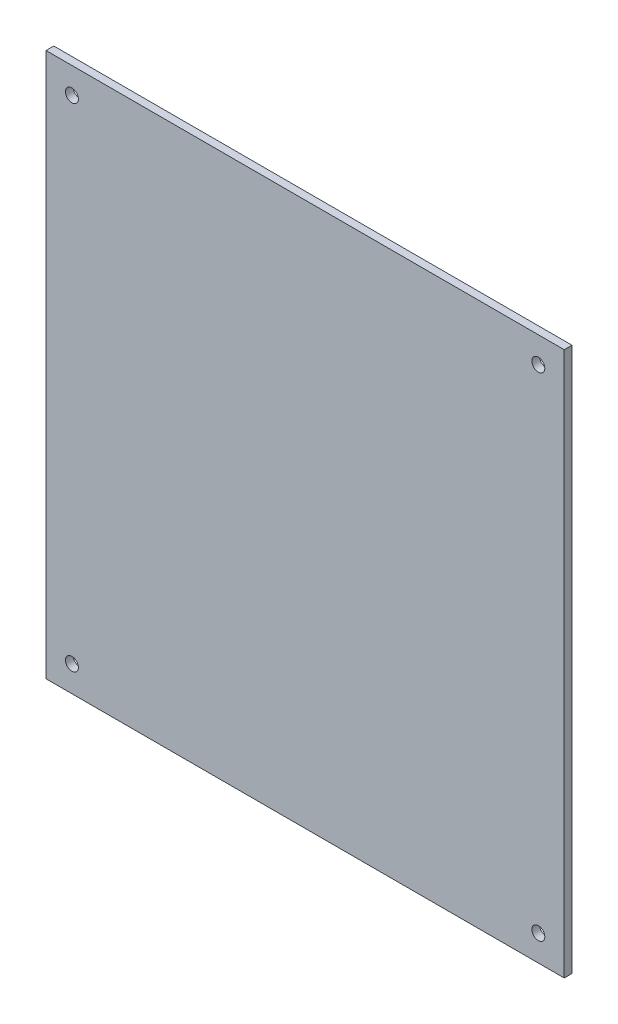
ISO-10303-21;
HEADER;
FILE_DESCRIPTION(('STEP AP214'),'2;1');
FILE_NAME('part.step','',(''),(''),'','','');
FILE_SCHEMA(('AUTOMOTIVE_DESIGN { 1 0 10303 214 1 1 1 1 }'));
ENDSEC;
DATA;
#1=APPLICATION_CONTEXT('core data for automotive mechanical design processes');
#2=APPLICATION_PROTOCOL_DEFINITION('international standard','automotive_design',2000,#1);
#3=PRODUCT_CONTEXT('',#1,'mechanical');
#4=PRODUCT('Part','Part','',(#3));
#5=PRODUCT_RELATED_PRODUCT_CATEGORY('part','',(#4));
#6=PRODUCT_DEFINITION_FORMATION('','',#4);
#7=PRODUCT_DEFINITION_CONTEXT('part definition',#1,'design');
#8=PRODUCT_DEFINITION('design','',#6,#7);
#9=PRODUCT_DEFINITION_SHAPE('','',#8);
#10=(LENGTH_UNIT() NAMED_UNIT(*) SI_UNIT(.MILLI.,.METRE.));
#11=(NAMED_UNIT(*) PLANE_ANGLE_UNIT() SI_UNIT($,.RADIAN.));
#12=(NAMED_UNIT(*) SI_UNIT($,.STERADIAN.) SOLID_ANGLE_UNIT());
#13=UNCERTAINTY_MEASURE_WITH_UNIT(LENGTH_MEASURE(1.E-05),#10,'distance_accuracy_value','');
#14=(GEOMETRIC_REPRESENTATION_CONTEXT(3) GLOBAL_UNCERTAINTY_ASSIGNED_CONTEXT((#13)) GLOBAL_UNIT_ASSIGNED_CONTEXT((#10,
#11,#12)) REPRESENTATION_CONTEXT('',''));
#15=CARTESIAN_POINT('',(0.,0.,0.));
#16=DIRECTION('',(0.,0.,1.));
#17=DIRECTION('',(1.,0.,0.));
#18=AXIS2_PLACEMENT_3D('',#15,#16,#17);
#19=CARTESIAN_POINT('',(2.19538609389673E-13,0.,-113.));
#20=DIRECTION('',(0.,0.,-1.));
#21=DIRECTION('',(-1.,0.,0.));
#22=AXIS2_PLACEMENT_3D('',#19,#20,#21);
#23=PLANE('',#22);
#24=CARTESIAN_POINT('',(2.18020859158961E-13,20.0000000000001,-113.));
#25=DIRECTION('',(0.,0.,-1.));
#26=DIRECTION('',(1.,0.,0.));
#27=AXIS2_PLACEMENT_3D('',#24,#25,#26);
#28=CIRCLE('',#27,2.5);
#29=CARTESIAN_POINT('',(2.50000000000022,20.0000000000001,-113.));
#30=VERTEX_POINT('',#29);
#31=EDGE_CURVE('E124',#30,#30,#28,.T.);
#32=ORIENTED_EDGE('',*,*,#31,.F.);
#33=EDGE_LOOP('',(#32));
#34=FACE_BOUND('',#33,.T.);
#35=CARTESIAN_POINT('',(2.18020859158961E-13,210.,-113.));
#36=DIRECTION('',(0.,0.,-1.));
#37=DIRECTION('',(-1.,0.,0.));
#38=AXIS2_PLACEMENT_3D('',#35,#36,#37);
#39=CIRCLE('',#38,2.5);
#40=CARTESIAN_POINT('',(-2.49999999999978,210.,-113.));
#41=VERTEX_POINT('',#40);
#42=EDGE_CURVE('E103',#41,#41,#39,.T.);
#43=ORIENTED_EDGE('',*,*,#42,.F.);
#44=EDGE_LOOP('',(#43));
#45=FACE_BOUND('',#44,.T.);
#46=DIRECTION('',(0.,-1.,0.));
#47=VECTOR('',#46,1.);
#48=CARTESIAN_POINT('',(190.,220.,-113.));
#49=LINE('',#48,#47);
#50=CARTESIAN_POINT('',(190.,220.,-113.));
#51=VERTEX_POINT('',#50);
#52=CARTESIAN_POINT('',(190.,10.0000000000001,-113.));
#53=VERTEX_POINT('',#52);
#54=EDGE_CURVE('E88',#51,#53,#49,.T.);
#55=ORIENTED_EDGE('',*,*,#54,.T.);
#56=DIRECTION('',(-1.,0.,0.));
#57=VECTOR('',#56,1.);
#58=CARTESIAN_POINT('',(190.,10.0000000000001,-113.));
#59=LINE('',#58,#57);
#60=CARTESIAN_POINT('',(-10.,10.0000000000001,-113.));
#61=VERTEX_POINT('',#60);
#62=EDGE_CURVE('E83',#53,#61,#59,.T.);
#63=ORIENTED_EDGE('',*,*,#62,.T.);
#64=DIRECTION('',(0.,1.,0.));
#65=VECTOR('',#64,1.);
#66=CARTESIAN_POINT('',(-10.,220.,-113.));
#67=LINE('',#66,#65);
#68=CARTESIAN_POINT('',(-10.,220.,-113.));
#69=VERTEX_POINT('',#68);
#70=EDGE_CURVE('E86',#61,#69,#67,.T.);
#71=ORIENTED_EDGE('',*,*,#70,.T.);
#72=DIRECTION('',(1.,0.,0.));
#73=VECTOR('',#72,1.);
#74=CARTESIAN_POINT('',(190.,220.,-113.));
#75=LINE('',#74,#73);
#76=EDGE_CURVE('E53',#69,#51,#75,.T.);
#77=ORIENTED_EDGE('',*,*,#76,.T.);
#78=EDGE_LOOP('',(#55,#63,#71,#77));
#79=FACE_BOUND('',#78,.T.);
#80=CARTESIAN_POINT('',(180.,210.,-113.));
#81=DIRECTION('',(0.,0.,-1.));
#82=DIRECTION('',(1.,0.,0.));
#83=AXIS2_PLACEMENT_3D('',#80,#81,#82);
#84=CIRCLE('',#83,2.5);
#85=CARTESIAN_POINT('',(182.5,210.,-113.));
#86=VERTEX_POINT('',#85);
#87=EDGE_CURVE('E118',#86,#86,#84,.T.);
#88=ORIENTED_EDGE('',*,*,#87,.F.);
#89=EDGE_LOOP('',(#88));
#90=FACE_BOUND('',#89,.T.);
#91=CARTESIAN_POINT('',(180.,20.0000000000001,-113.));
#92=DIRECTION('',(0.,0.,-1.));
#93=DIRECTION('',(-1.,0.,0.));
#94=AXIS2_PLACEMENT_3D('',#91,#92,#93);
#95=CIRCLE('',#94,2.5);
#96=CARTESIAN_POINT('',(177.5,20.0000000000001,-113.));
#97=VERTEX_POINT('',#96);
#98=EDGE_CURVE('E130',#97,#97,#95,.T.);
#99=ORIENTED_EDGE('',*,*,#98,.F.);
#100=EDGE_LOOP('',(#99));
#101=FACE_BOUND('',#100,.T.);
#102=ADVANCED_FACE('F36',(#34,#45,#79,#90,#101),#23,.T.);
#103=CARTESIAN_POINT('',(2.13717932240343E-13,0.,-110.));
#104=DIRECTION('',(0.,0.,-1.));
#105=DIRECTION('',(-1.,0.,0.));
#106=AXIS2_PLACEMENT_3D('',#103,#104,#105);
#107=PLANE('',#106);
#108=DIRECTION('',(0.,-1.,0.));
#109=VECTOR('',#108,1.);
#110=CARTESIAN_POINT('',(190.,220.,-110.));
#111=LINE('',#110,#109);
#112=CARTESIAN_POINT('',(190.,220.,-110.));
#113=VERTEX_POINT('',#112);
#114=CARTESIAN_POINT('',(190.,10.0000000000001,-110.));
#115=VERTEX_POINT('',#114);
#116=EDGE_CURVE('E100',#113,#115,#111,.T.);
#117=ORIENTED_EDGE('',*,*,#116,.F.);
#118=DIRECTION('',(1.,0.,0.));
#119=VECTOR('',#118,1.);
#120=CARTESIAN_POINT('',(190.,220.,-110.));
#121=LINE('',#120,#119);
#122=CARTESIAN_POINT('',(-10.,220.,-110.));
#123=VERTEX_POINT('',#122);
#124=EDGE_CURVE('E76',#123,#113,#121,.T.);
#125=ORIENTED_EDGE('',*,*,#124,.F.);
#126=DIRECTION('',(0.,1.,0.));
#127=VECTOR('',#126,1.);
#128=CARTESIAN_POINT('',(-10.,220.,-110.));
#129=LINE('',#128,#127);
#130=CARTESIAN_POINT('',(-10.,10.0000000000001,-110.));
#131=VERTEX_POINT('',#130);
#132=EDGE_CURVE('E70',#131,#123,#129,.T.);
#133=ORIENTED_EDGE('',*,*,#132,.F.);
#134=DIRECTION('',(-1.,0.,0.));
#135=VECTOR('',#134,1.);
#136=CARTESIAN_POINT('',(190.,10.0000000000001,-110.));
#137=LINE('',#136,#135);
#138=EDGE_CURVE('E92',#115,#131,#137,.T.);
#139=ORIENTED_EDGE('',*,*,#138,.F.);
#140=EDGE_LOOP('',(#117,#125,#133,#139));
#141=FACE_BOUND('',#140,.T.);
#142=CARTESIAN_POINT('',(2.1220018200963E-13,210.,-110.));
#143=DIRECTION('',(0.,0.,-1.));
#144=DIRECTION('',(-1.,0.,0.));
#145=AXIS2_PLACEMENT_3D('',#142,#143,#144);
#146=CIRCLE('',#145,2.5);
#147=CARTESIAN_POINT('',(-2.49999999999979,210.,-110.));
#148=VERTEX_POINT('',#147);
#149=EDGE_CURVE('E115',#148,#148,#146,.T.);
#150=ORIENTED_EDGE('',*,*,#149,.T.);
#151=EDGE_LOOP('',(#150));
#152=FACE_BOUND('',#151,.T.);
#153=CARTESIAN_POINT('',(180.,210.,-110.));
#154=DIRECTION('',(0.,0.,-1.));
#155=DIRECTION('',(1.,0.,0.));
#156=AXIS2_PLACEMENT_3D('',#153,#154,#155);
#157=CIRCLE('',#156,2.5);
#158=CARTESIAN_POINT('',(182.5,210.,-110.));
#159=VERTEX_POINT('',#158);
#160=EDGE_CURVE('E121',#159,#159,#157,.T.);
#161=ORIENTED_EDGE('',*,*,#160,.T.);
#162=EDGE_LOOP('',(#161));
#163=FACE_BOUND('',#162,.T.);
#164=CARTESIAN_POINT('',(2.1220018200963E-13,20.0000000000001,-110.));
#165=DIRECTION('',(0.,0.,-1.));
#166=DIRECTION('',(1.,0.,0.));
#167=AXIS2_PLACEMENT_3D('',#164,#165,#166);
#168=CIRCLE('',#167,2.5);
#169=CARTESIAN_POINT('',(2.50000000000021,20.0000000000001,-110.));
#170=VERTEX_POINT('',#169);
#171=EDGE_CURVE('E127',#170,#170,#168,.T.);
#172=ORIENTED_EDGE('',*,*,#171,.T.);
#173=EDGE_LOOP('',(#172));
#174=FACE_BOUND('',#173,.T.);
#175=CARTESIAN_POINT('',(180.,20.0000000000001,-110.));
#176=DIRECTION('',(0.,0.,-1.));
#177=DIRECTION('',(-1.,0.,0.));
#178=AXIS2_PLACEMENT_3D('',#175,#176,#177);
#179=CIRCLE('',#178,2.5);
#180=CARTESIAN_POINT('',(177.5,20.0000000000001,-110.));
#181=VERTEX_POINT('',#180);
#182=EDGE_CURVE('E133',#181,#181,#179,.T.);
#183=ORIENTED_EDGE('',*,*,#182,.T.);
#184=EDGE_LOOP('',(#183));
#185=FACE_BOUND('',#184,.T.);
#186=ADVANCED_FACE('F111',(#141,#152,#163,#174,#185),#107,.F.);
#187=CARTESIAN_POINT('',(190.,220.,-113.));
#188=DIRECTION('',(-1.,0.,0.));
#189=DIRECTION('',(0.,0.,1.));
#190=AXIS2_PLACEMENT_3D('',#187,#188,#189);
#191=PLANE('',#190);
#192=ORIENTED_EDGE('',*,*,#116,.T.);
#193=DIRECTION('',(0.,0.,1.));
#194=VECTOR('',#193,1.);
#195=CARTESIAN_POINT('',(190.,10.0000000000001,-113.));
#196=LINE('',#195,#194);
#197=EDGE_CURVE('E11',#53,#115,#196,.T.);
#198=ORIENTED_EDGE('',*,*,#197,.F.);
#199=ORIENTED_EDGE('',*,*,#54,.F.);
#200=DIRECTION('',(0.,0.,1.));
#201=VECTOR('',#200,1.);
#202=CARTESIAN_POINT('',(190.,220.,-113.));
#203=LINE('',#202,#201);
#204=EDGE_CURVE('E96',#51,#113,#203,.T.);
#205=ORIENTED_EDGE('',*,*,#204,.T.);
#206=EDGE_LOOP('',(#192,#198,#199,#205));
#207=FACE_BOUND('',#206,.T.);
#208=ADVANCED_FACE('F38',(#207),#191,.F.);
#209=CARTESIAN_POINT('',(190.,10.0000000000001,-113.));
#210=DIRECTION('',(0.,1.,0.));
#211=DIRECTION('',(0.,0.,1.));
#212=AXIS2_PLACEMENT_3D('',#209,#210,#211);
#213=PLANE('',#212);
#214=ORIENTED_EDGE('',*,*,#138,.T.);
#215=DIRECTION('',(0.,0.,1.));
#216=VECTOR('',#215,1.);
#217=CARTESIAN_POINT('',(-10.,10.0000000000001,-113.));
#218=LINE('',#217,#216);
#219=EDGE_CURVE('E45',#61,#131,#218,.T.);
#220=ORIENTED_EDGE('',*,*,#219,.F.);
#221=ORIENTED_EDGE('',*,*,#62,.F.);
#222=ORIENTED_EDGE('',*,*,#197,.T.);
#223=EDGE_LOOP('',(#214,#220,#221,#222));
#224=FACE_BOUND('',#223,.T.);
#225=ADVANCED_FACE('F91',(#224),#213,.F.);
#226=CARTESIAN_POINT('',(-10.,220.,-113.));
#227=DIRECTION('',(1.,0.,0.));
#228=DIRECTION('',(0.,0.,-1.));
#229=AXIS2_PLACEMENT_3D('',#226,#227,#228);
#230=PLANE('',#229);
#231=ORIENTED_EDGE('',*,*,#132,.T.);
#232=DIRECTION('',(0.,0.,1.));
#233=VECTOR('',#232,1.);
#234=CARTESIAN_POINT('',(-10.,220.,-113.));
#235=LINE('',#234,#233);
#236=EDGE_CURVE('E93',#69,#123,#235,.T.);
#237=ORIENTED_EDGE('',*,*,#236,.F.);
#238=ORIENTED_EDGE('',*,*,#70,.F.);
#239=ORIENTED_EDGE('',*,*,#219,.T.);
#240=EDGE_LOOP('',(#231,#237,#238,#239));
#241=FACE_BOUND('',#240,.T.);
#242=ADVANCED_FACE('F94',(#241),#230,.F.);
#243=CARTESIAN_POINT('',(190.,220.,-113.));
#244=DIRECTION('',(0.,-1.,0.));
#245=DIRECTION('',(0.,0.,-1.));
#246=AXIS2_PLACEMENT_3D('',#243,#244,#245);
#247=PLANE('',#246);
#248=ORIENTED_EDGE('',*,*,#124,.T.);
#249=ORIENTED_EDGE('',*,*,#204,.F.);
#250=ORIENTED_EDGE('',*,*,#76,.F.);
#251=ORIENTED_EDGE('',*,*,#236,.T.);
#252=EDGE_LOOP('',(#248,#249,#250,#251));
#253=FACE_BOUND('',#252,.T.);
#254=ADVANCED_FACE('F108',(#253),#247,.F.);
#255=CARTESIAN_POINT('',(2.18020859158961E-13,210.,-113.));
#256=DIRECTION('',(0.,0.,1.));
#257=DIRECTION('',(1.,0.,0.));
#258=AXIS2_PLACEMENT_3D('',#255,#256,#257);
#259=CYLINDRICAL_SURFACE('',#258,2.5);
#260=ORIENTED_EDGE('',*,*,#42,.T.);
#261=EDGE_LOOP('',(#260));
#262=FACE_BOUND('',#261,.T.);
#263=ORIENTED_EDGE('',*,*,#149,.F.);
#264=EDGE_LOOP('',(#263));
#265=FACE_BOUND('',#264,.T.);
#266=ADVANCED_FACE('F152',(#262,#265),#259,.F.);
#267=CARTESIAN_POINT('',(180.,210.,-113.));
#268=DIRECTION('',(0.,0.,1.));
#269=DIRECTION('',(1.,0.,0.));
#270=AXIS2_PLACEMENT_3D('',#267,#268,#269);
#271=CYLINDRICAL_SURFACE('',#270,2.5);
#272=ORIENTED_EDGE('',*,*,#87,.T.);
#273=EDGE_LOOP('',(#272));
#274=FACE_BOUND('',#273,.T.);
#275=ORIENTED_EDGE('',*,*,#160,.F.);
#276=EDGE_LOOP('',(#275));
#277=FACE_BOUND('',#276,.T.);
#278=ADVANCED_FACE('F220',(#274,#277),#271,.F.);
#279=CARTESIAN_POINT('',(2.18020859158961E-13,20.0000000000001,-113.));
#280=DIRECTION('',(0.,0.,1.));
#281=DIRECTION('',(1.,0.,0.));
#282=AXIS2_PLACEMENT_3D('',#279,#280,#281);
#283=CYLINDRICAL_SURFACE('',#282,2.5);
#284=ORIENTED_EDGE('',*,*,#31,.T.);
#285=EDGE_LOOP('',(#284));
#286=FACE_BOUND('',#285,.T.);
#287=ORIENTED_EDGE('',*,*,#171,.F.);
#288=EDGE_LOOP('',(#287));
#289=FACE_BOUND('',#288,.T.);
#290=ADVANCED_FACE('F229',(#286,#289),#283,.F.);
#291=CARTESIAN_POINT('',(180.,20.0000000000001,-113.));
#292=DIRECTION('',(0.,0.,1.));
#293=DIRECTION('',(1.,0.,0.));
#294=AXIS2_PLACEMENT_3D('',#291,#292,#293);
#295=CYLINDRICAL_SURFACE('',#294,2.5);
#296=ORIENTED_EDGE('',*,*,#98,.T.);
#297=EDGE_LOOP('',(#296));
#298=FACE_BOUND('',#297,.T.);
#299=ORIENTED_EDGE('',*,*,#182,.F.);
#300=EDGE_LOOP('',(#299));
#301=FACE_BOUND('',#300,.T.);
#302=ADVANCED_FACE('F139',(#298,#301),#295,.F.);
#303=CLOSED_SHELL('',(#102,#186,#208,#225,#242,#254,#266,#278,#290,#302));
#304=MANIFOLD_SOLID_BREP('B2',#303);
#305=ADVANCED_BREP_SHAPE_REPRESENTATION('',(#18,#304),#14);
#306=SHAPE_DEFINITION_REPRESENTATION(#9,#305);
ENDSEC;
END-ISO-10303-21;
